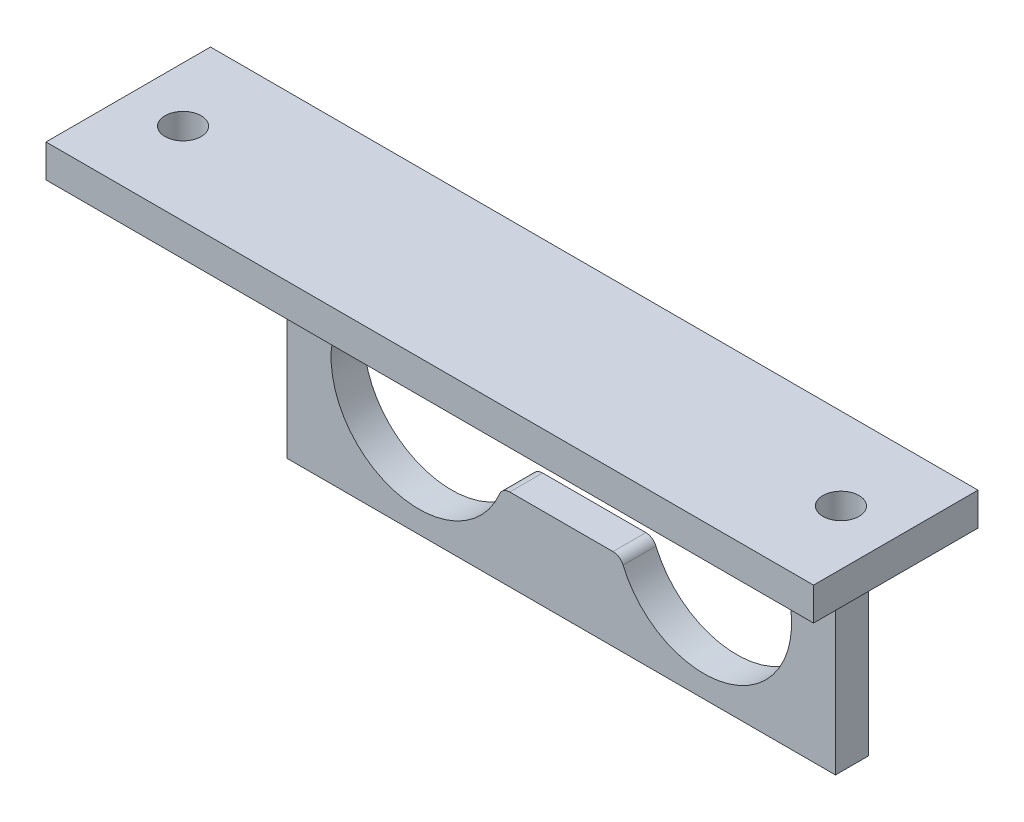
ISO-10303-21;
HEADER;
FILE_DESCRIPTION(('STEP AP214'),'2;1');
FILE_NAME('part.step','',(''),(''),'','','');
FILE_SCHEMA(('AUTOMOTIVE_DESIGN { 1 0 10303 214 1 1 1 1 }'));
ENDSEC;
DATA;
#1=APPLICATION_CONTEXT('core data for automotive mechanical design processes');
#2=APPLICATION_PROTOCOL_DEFINITION('international standard','automotive_design',2000,#1);
#3=PRODUCT_CONTEXT('',#1,'mechanical');
#4=PRODUCT('Part','Part','',(#3));
#5=PRODUCT_RELATED_PRODUCT_CATEGORY('part','',(#4));
#6=PRODUCT_DEFINITION_FORMATION('','',#4);
#7=PRODUCT_DEFINITION_CONTEXT('part definition',#1,'design');
#8=PRODUCT_DEFINITION('design','',#6,#7);
#9=PRODUCT_DEFINITION_SHAPE('','',#8);
#10=(LENGTH_UNIT() NAMED_UNIT(*) SI_UNIT(.MILLI.,.METRE.));
#11=(NAMED_UNIT(*) PLANE_ANGLE_UNIT() SI_UNIT($,.RADIAN.));
#12=(NAMED_UNIT(*) SI_UNIT($,.STERADIAN.) SOLID_ANGLE_UNIT());
#13=UNCERTAINTY_MEASURE_WITH_UNIT(LENGTH_MEASURE(1.E-05),#10,'distance_accuracy_value','');
#14=(GEOMETRIC_REPRESENTATION_CONTEXT(3) GLOBAL_UNCERTAINTY_ASSIGNED_CONTEXT((#13)) GLOBAL_UNIT_ASSIGNED_CONTEXT((#10,
#11,#12)) REPRESENTATION_CONTEXT('',''));
#15=CARTESIAN_POINT('',(0.,0.,0.));
#16=DIRECTION('',(0.,0.,1.));
#17=DIRECTION('',(1.,0.,0.));
#18=AXIS2_PLACEMENT_3D('',#15,#16,#17);
#19=CARTESIAN_POINT('',(-25.,16.,15.));
#20=DIRECTION('',(0.,0.,-1.));
#21=DIRECTION('',(-1.,0.,0.));
#22=AXIS2_PLACEMENT_3D('',#19,#20,#21);
#23=PLANE('',#22);
#24=DIRECTION('',(-1.,0.,0.));
#25=VECTOR('',#24,1.);
#26=CARTESIAN_POINT('',(25.,13.,15.));
#27=LINE('',#26,#25);
#28=CARTESIAN_POINT('',(35.,13.,15.));
#29=VERTEX_POINT('',#28);
#30=CARTESIAN_POINT('',(-35.,13.,15.));
#31=VERTEX_POINT('',#30);
#32=EDGE_CURVE('E212',#29,#31,#27,.T.);
#33=ORIENTED_EDGE('',*,*,#32,.F.);
#34=DIRECTION('',(0.,1.,0.));
#35=VECTOR('',#34,1.);
#36=CARTESIAN_POINT('',(35.,13.,15.));
#37=LINE('',#36,#35);
#38=CARTESIAN_POINT('',(35.,16.,15.));
#39=VERTEX_POINT('',#38);
#40=EDGE_CURVE('E240',#29,#39,#37,.T.);
#41=ORIENTED_EDGE('',*,*,#40,.T.);
#42=DIRECTION('',(1.,0.,0.));
#43=VECTOR('',#42,1.);
#44=CARTESIAN_POINT('',(-25.,16.,15.));
#45=LINE('',#44,#43);
#46=CARTESIAN_POINT('',(-35.,16.,15.));
#47=VERTEX_POINT('',#46);
#48=EDGE_CURVE('E256',#47,#39,#45,.T.);
#49=ORIENTED_EDGE('',*,*,#48,.F.);
#50=DIRECTION('',(0.,1.,0.));
#51=VECTOR('',#50,1.);
#52=CARTESIAN_POINT('',(-35.,13.,15.));
#53=LINE('',#52,#51);
#54=EDGE_CURVE('E207',#31,#47,#53,.T.);
#55=ORIENTED_EDGE('',*,*,#54,.F.);
#56=EDGE_LOOP('',(#33,#41,#49,#55));
#57=FACE_BOUND('',#56,.T.);
#58=ADVANCED_FACE('F39',(#57),#23,.F.);
#59=CARTESIAN_POINT('',(0.,0.,3.));
#60=DIRECTION('',(0.,0.,1.));
#61=DIRECTION('',(1.,0.,0.));
#62=AXIS2_PLACEMENT_3D('',#59,#60,#61);
#63=PLANE('',#62);
#64=DIRECTION('',(1.,0.,0.));
#65=VECTOR('',#64,1.);
#66=CARTESIAN_POINT('',(25.,13.,3.));
#67=LINE('',#66,#65);
#68=CARTESIAN_POINT('',(-26.,13.,3.));
#69=VERTEX_POINT('',#68);
#70=CARTESIAN_POINT('',(26.,13.,3.));
#71=VERTEX_POINT('',#70);
#72=EDGE_CURVE('E253',#69,#71,#67,.T.);
#73=ORIENTED_EDGE('',*,*,#72,.F.);
#74=CARTESIAN_POINT('',(-26.,12.,3.));
#75=DIRECTION('',(0.,0.,1.));
#76=DIRECTION('',(1.,0.,0.));
#77=AXIS2_PLACEMENT_3D('',#74,#75,#76);
#78=CIRCLE('',#77,1.);
#79=CARTESIAN_POINT('',(-25.,12.,3.));
#80=VERTEX_POINT('',#79);
#81=EDGE_CURVE('E11',#69,#80,#78,.F.);
#82=ORIENTED_EDGE('',*,*,#81,.T.);
#83=DIRECTION('',(0.,-1.,0.));
#84=VECTOR('',#83,1.);
#85=CARTESIAN_POINT('',(-25.,-10.,3.));
#86=LINE('',#85,#84);
#87=CARTESIAN_POINT('',(-25.,-10.,3.));
#88=VERTEX_POINT('',#87);
#89=EDGE_CURVE('E389',#80,#88,#86,.T.);
#90=ORIENTED_EDGE('',*,*,#89,.T.);
#91=DIRECTION('',(1.,0.,0.));
#92=VECTOR('',#91,1.);
#93=CARTESIAN_POINT('',(25.,-10.,3.));
#94=LINE('',#93,#92);
#95=CARTESIAN_POINT('',(25.,-10.,3.));
#96=VERTEX_POINT('',#95);
#97=EDGE_CURVE('E392',#88,#96,#94,.T.);
#98=ORIENTED_EDGE('',*,*,#97,.T.);
#99=DIRECTION('',(0.,1.,0.));
#100=VECTOR('',#99,1.);
#101=CARTESIAN_POINT('',(25.,-10.,3.));
#102=LINE('',#101,#100);
#103=CARTESIAN_POINT('',(25.,12.,3.));
#104=VERTEX_POINT('',#103);
#105=EDGE_CURVE('E396',#96,#104,#102,.T.);
#106=ORIENTED_EDGE('',*,*,#105,.T.);
#107=CARTESIAN_POINT('',(26.,12.,3.));
#108=DIRECTION('',(0.,0.,1.));
#109=DIRECTION('',(1.,0.,0.));
#110=AXIS2_PLACEMENT_3D('',#107,#108,#109);
#111=CIRCLE('',#110,1.);
#112=EDGE_CURVE('E429',#104,#71,#111,.F.);
#113=ORIENTED_EDGE('',*,*,#112,.T.);
#114=EDGE_LOOP('',(#73,#82,#90,#98,#106,#113));
#115=FACE_BOUND('',#114,.T.);
#116=CARTESIAN_POINT('',(13.,0.,3.));
#117=DIRECTION('',(0.,0.,1.));
#118=DIRECTION('',(1.,0.,0.));
#119=AXIS2_PLACEMENT_3D('',#116,#117,#118);
#120=CIRCLE('',#119,8.);
#121=CARTESIAN_POINT('',(5.62972268809911,-3.11111111111111,3.));
#122=VERTEX_POINT('',#121);
#123=CARTESIAN_POINT('',(5.62972268809911,3.11111111111111,3.));
#124=VERTEX_POINT('',#123);
#125=EDGE_CURVE('E309',#122,#124,#120,.T.);
#126=ORIENTED_EDGE('',*,*,#125,.F.);
#127=CARTESIAN_POINT('',(4.7084380241115,-3.5,3.));
#128=DIRECTION('',(0.,0.,-1.));
#129=DIRECTION('',(-1.,0.,0.));
#130=AXIS2_PLACEMENT_3D('',#127,#128,#129);
#131=CIRCLE('',#130,1.);
#132=CARTESIAN_POINT('',(4.7084380241115,-2.5,3.));
#133=VERTEX_POINT('',#132);
#134=EDGE_CURVE('E306',#133,#122,#131,.T.);
#135=ORIENTED_EDGE('',*,*,#134,.F.);
#136=DIRECTION('',(1.,0.,0.));
#137=VECTOR('',#136,1.);
#138=CARTESIAN_POINT('',(4.7084380241115,-2.5,3.));
#139=LINE('',#138,#137);
#140=CARTESIAN_POINT('',(-4.7084380241115,-2.5,3.));
#141=VERTEX_POINT('',#140);
#142=EDGE_CURVE('E329',#141,#133,#139,.T.);
#143=ORIENTED_EDGE('',*,*,#142,.F.);
#144=CARTESIAN_POINT('',(-4.7084380241115,-3.5,3.));
#145=DIRECTION('',(0.,0.,-1.));
#146=DIRECTION('',(1.,0.,0.));
#147=AXIS2_PLACEMENT_3D('',#144,#145,#146);
#148=CIRCLE('',#147,1.);
#149=CARTESIAN_POINT('',(-5.62972268809911,-3.11111111111111,3.));
#150=VERTEX_POINT('',#149);
#151=EDGE_CURVE('E325',#150,#141,#148,.T.);
#152=ORIENTED_EDGE('',*,*,#151,.F.);
#153=CARTESIAN_POINT('',(-13.,0.,3.));
#154=DIRECTION('',(0.,0.,1.));
#155=DIRECTION('',(1.,0.,0.));
#156=AXIS2_PLACEMENT_3D('',#153,#154,#155);
#157=CIRCLE('',#156,8.);
#158=CARTESIAN_POINT('',(-5.62972268809911,3.11111111111111,3.));
#159=VERTEX_POINT('',#158);
#160=EDGE_CURVE('E322',#159,#150,#157,.T.);
#161=ORIENTED_EDGE('',*,*,#160,.F.);
#162=CARTESIAN_POINT('',(-4.7084380241115,3.5,3.));
#163=DIRECTION('',(0.,0.,-1.));
#164=DIRECTION('',(-1.,0.,0.));
#165=AXIS2_PLACEMENT_3D('',#162,#163,#164);
#166=CIRCLE('',#165,1.);
#167=CARTESIAN_POINT('',(-4.7084380241115,2.5,3.));
#168=VERTEX_POINT('',#167);
#169=EDGE_CURVE('E319',#168,#159,#166,.T.);
#170=ORIENTED_EDGE('',*,*,#169,.F.);
#171=DIRECTION('',(-1.,0.,0.));
#172=VECTOR('',#171,1.);
#173=CARTESIAN_POINT('',(-4.7084380241115,2.5,3.));
#174=LINE('',#173,#172);
#175=CARTESIAN_POINT('',(4.7084380241115,2.5,3.));
#176=VERTEX_POINT('',#175);
#177=EDGE_CURVE('E316',#176,#168,#174,.T.);
#178=ORIENTED_EDGE('',*,*,#177,.F.);
#179=CARTESIAN_POINT('',(4.7084380241115,3.5,3.));
#180=DIRECTION('',(0.,0.,-1.));
#181=DIRECTION('',(1.,0.,0.));
#182=AXIS2_PLACEMENT_3D('',#179,#180,#181);
#183=CIRCLE('',#182,1.);
#184=EDGE_CURVE('E313',#124,#176,#183,.T.);
#185=ORIENTED_EDGE('',*,*,#184,.F.);
#186=EDGE_LOOP('',(#126,#135,#143,#152,#161,#170,#178,#185));
#187=FACE_BOUND('',#186,.T.);
#188=DIRECTION('',(-1.,0.,0.));
#189=VECTOR('',#188,1.);
#190=CARTESIAN_POINT('',(3.25,9.,3.));
#191=LINE('',#190,#189);
#192=CARTESIAN_POINT('',(3.25,9.,3.));
#193=VERTEX_POINT('',#192);
#194=CARTESIAN_POINT('',(-3.25,9.,3.));
#195=VERTEX_POINT('',#194);
#196=EDGE_CURVE('E266',#193,#195,#191,.T.);
#197=ORIENTED_EDGE('',*,*,#196,.F.);
#198=CARTESIAN_POINT('',(3.25,7.25,3.));
#199=DIRECTION('',(0.,0.,1.));
#200=DIRECTION('',(1.,0.,0.));
#201=AXIS2_PLACEMENT_3D('',#198,#199,#200);
#202=CIRCLE('',#201,1.75);
#203=CARTESIAN_POINT('',(3.25,5.5,3.));
#204=VERTEX_POINT('',#203);
#205=EDGE_CURVE('E263',#204,#193,#202,.T.);
#206=ORIENTED_EDGE('',*,*,#205,.F.);
#207=DIRECTION('',(1.,0.,0.));
#208=VECTOR('',#207,1.);
#209=CARTESIAN_POINT('',(3.25,5.5,3.));
#210=LINE('',#209,#208);
#211=CARTESIAN_POINT('',(-3.25,5.5,3.));
#212=VERTEX_POINT('',#211);
#213=EDGE_CURVE('E274',#212,#204,#210,.T.);
#214=ORIENTED_EDGE('',*,*,#213,.F.);
#215=CARTESIAN_POINT('',(-3.25,7.25,3.));
#216=DIRECTION('',(0.,0.,1.));
#217=DIRECTION('',(1.,0.,0.));
#218=AXIS2_PLACEMENT_3D('',#215,#216,#217);
#219=CIRCLE('',#218,1.75);
#220=EDGE_CURVE('E270',#195,#212,#219,.T.);
#221=ORIENTED_EDGE('',*,*,#220,.F.);
#222=EDGE_LOOP('',(#197,#206,#214,#221));
#223=FACE_BOUND('',#222,.T.);
#224=ADVANCED_FACE('F448',(#115,#187,#223),#63,.T.);
#225=CARTESIAN_POINT('',(0.,0.,0.));
#226=DIRECTION('',(0.,0.,1.));
#227=DIRECTION('',(1.,0.,0.));
#228=AXIS2_PLACEMENT_3D('',#225,#226,#227);
#229=PLANE('',#228);
#230=CARTESIAN_POINT('',(4.7084380241115,-3.5,0.));
#231=DIRECTION('',(0.,0.,-1.));
#232=DIRECTION('',(-1.,0.,0.));
#233=AXIS2_PLACEMENT_3D('',#230,#231,#232);
#234=CIRCLE('',#233,1.);
#235=CARTESIAN_POINT('',(4.7084380241115,-2.5,0.));
#236=VERTEX_POINT('',#235);
#237=CARTESIAN_POINT('',(5.62972268809911,-3.11111111111111,0.));
#238=VERTEX_POINT('',#237);
#239=EDGE_CURVE('E305',#236,#238,#234,.T.);
#240=ORIENTED_EDGE('',*,*,#239,.T.);
#241=CARTESIAN_POINT('',(13.,0.,0.));
#242=DIRECTION('',(0.,0.,1.));
#243=DIRECTION('',(1.,0.,0.));
#244=AXIS2_PLACEMENT_3D('',#241,#242,#243);
#245=CIRCLE('',#244,8.);
#246=CARTESIAN_POINT('',(5.62972268809911,3.11111111111111,0.));
#247=VERTEX_POINT('',#246);
#248=EDGE_CURVE('E336',#238,#247,#245,.T.);
#249=ORIENTED_EDGE('',*,*,#248,.T.);
#250=CARTESIAN_POINT('',(4.7084380241115,3.5,0.));
#251=DIRECTION('',(0.,0.,-1.));
#252=DIRECTION('',(1.,0.,0.));
#253=AXIS2_PLACEMENT_3D('',#250,#251,#252);
#254=CIRCLE('',#253,1.);
#255=CARTESIAN_POINT('',(4.7084380241115,2.5,0.));
#256=VERTEX_POINT('',#255);
#257=EDGE_CURVE('E340',#247,#256,#254,.T.);
#258=ORIENTED_EDGE('',*,*,#257,.T.);
#259=DIRECTION('',(-1.,0.,0.));
#260=VECTOR('',#259,1.);
#261=CARTESIAN_POINT('',(-4.7084380241115,2.5,0.));
#262=LINE('',#261,#260);
#263=CARTESIAN_POINT('',(-4.7084380241115,2.5,0.));
#264=VERTEX_POINT('',#263);
#265=EDGE_CURVE('E344',#256,#264,#262,.T.);
#266=ORIENTED_EDGE('',*,*,#265,.T.);
#267=CARTESIAN_POINT('',(-4.7084380241115,3.5,0.));
#268=DIRECTION('',(0.,0.,-1.));
#269=DIRECTION('',(-1.,0.,0.));
#270=AXIS2_PLACEMENT_3D('',#267,#268,#269);
#271=CIRCLE('',#270,1.);
#272=CARTESIAN_POINT('',(-5.62972268809911,3.11111111111111,0.));
#273=VERTEX_POINT('',#272);
#274=EDGE_CURVE('E348',#264,#273,#271,.T.);
#275=ORIENTED_EDGE('',*,*,#274,.T.);
#276=CARTESIAN_POINT('',(-13.,0.,0.));
#277=DIRECTION('',(0.,0.,1.));
#278=DIRECTION('',(1.,0.,0.));
#279=AXIS2_PLACEMENT_3D('',#276,#277,#278);
#280=CIRCLE('',#279,8.);
#281=CARTESIAN_POINT('',(-5.62972268809911,-3.11111111111111,0.));
#282=VERTEX_POINT('',#281);
#283=EDGE_CURVE('E352',#273,#282,#280,.T.);
#284=ORIENTED_EDGE('',*,*,#283,.T.);
#285=CARTESIAN_POINT('',(-4.7084380241115,-3.5,0.));
#286=DIRECTION('',(0.,0.,-1.));
#287=DIRECTION('',(1.,0.,0.));
#288=AXIS2_PLACEMENT_3D('',#285,#286,#287);
#289=CIRCLE('',#288,1.);
#290=CARTESIAN_POINT('',(-4.7084380241115,-2.5,0.));
#291=VERTEX_POINT('',#290);
#292=EDGE_CURVE('E356',#282,#291,#289,.T.);
#293=ORIENTED_EDGE('',*,*,#292,.T.);
#294=DIRECTION('',(1.,0.,0.));
#295=VECTOR('',#294,1.);
#296=CARTESIAN_POINT('',(4.7084380241115,-2.5,0.));
#297=LINE('',#296,#295);
#298=EDGE_CURVE('E310',#291,#236,#297,.T.);
#299=ORIENTED_EDGE('',*,*,#298,.T.);
#300=EDGE_LOOP('',(#240,#249,#258,#266,#275,#284,#293,#299));
#301=FACE_BOUND('',#300,.T.);
#302=DIRECTION('',(0.,-1.,0.));
#303=VECTOR('',#302,1.);
#304=CARTESIAN_POINT('',(-25.,-10.,0.));
#305=LINE('',#304,#303);
#306=CARTESIAN_POINT('',(-25.,12.,0.));
#307=VERTEX_POINT('',#306);
#308=CARTESIAN_POINT('',(-25.,-10.,0.));
#309=VERTEX_POINT('',#308);
#310=EDGE_CURVE('E388',#307,#309,#305,.T.);
#311=ORIENTED_EDGE('',*,*,#310,.F.);
#312=CARTESIAN_POINT('',(-26.,12.,0.));
#313=DIRECTION('',(0.,0.,1.));
#314=DIRECTION('',(1.,0.,0.));
#315=AXIS2_PLACEMENT_3D('',#312,#313,#314);
#316=CIRCLE('',#315,1.);
#317=CARTESIAN_POINT('',(-26.,13.,0.));
#318=VERTEX_POINT('',#317);
#319=EDGE_CURVE('E48',#307,#318,#316,.T.);
#320=ORIENTED_EDGE('',*,*,#319,.T.);
#321=DIRECTION('',(-1.,0.,0.));
#322=VECTOR('',#321,1.);
#323=CARTESIAN_POINT('',(-25.,13.,0.));
#324=LINE('',#323,#322);
#325=CARTESIAN_POINT('',(-35.,13.,0.));
#326=VERTEX_POINT('',#325);
#327=EDGE_CURVE('E187',#318,#326,#324,.T.);
#328=ORIENTED_EDGE('',*,*,#327,.T.);
#329=DIRECTION('',(0.,1.,0.));
#330=VECTOR('',#329,1.);
#331=CARTESIAN_POINT('',(-35.,13.,0.));
#332=LINE('',#331,#330);
#333=CARTESIAN_POINT('',(-35.,16.,0.));
#334=VERTEX_POINT('',#333);
#335=EDGE_CURVE('E192',#326,#334,#332,.T.);
#336=ORIENTED_EDGE('',*,*,#335,.T.);
#337=DIRECTION('',(-1.,0.,0.));
#338=VECTOR('',#337,1.);
#339=CARTESIAN_POINT('',(-25.,16.,0.));
#340=LINE('',#339,#338);
#341=CARTESIAN_POINT('',(35.,16.,0.));
#342=VERTEX_POINT('',#341);
#343=EDGE_CURVE('E259',#342,#334,#340,.T.);
#344=ORIENTED_EDGE('',*,*,#343,.F.);
#345=DIRECTION('',(0.,1.,0.));
#346=VECTOR('',#345,1.);
#347=CARTESIAN_POINT('',(35.,13.,0.));
#348=LINE('',#347,#346);
#349=CARTESIAN_POINT('',(35.,13.,0.));
#350=VERTEX_POINT('',#349);
#351=EDGE_CURVE('E244',#350,#342,#348,.T.);
#352=ORIENTED_EDGE('',*,*,#351,.F.);
#353=DIRECTION('',(-1.,0.,0.));
#354=VECTOR('',#353,1.);
#355=CARTESIAN_POINT('',(25.,13.,0.));
#356=LINE('',#355,#354);
#357=CARTESIAN_POINT('',(26.,13.,0.));
#358=VERTEX_POINT('',#357);
#359=EDGE_CURVE('E236',#350,#358,#356,.T.);
#360=ORIENTED_EDGE('',*,*,#359,.T.);
#361=CARTESIAN_POINT('',(26.,12.,0.));
#362=DIRECTION('',(0.,0.,1.));
#363=DIRECTION('',(1.,0.,0.));
#364=AXIS2_PLACEMENT_3D('',#361,#362,#363);
#365=CIRCLE('',#364,1.);
#366=CARTESIAN_POINT('',(25.,12.,0.));
#367=VERTEX_POINT('',#366);
#368=EDGE_CURVE('E433',#358,#367,#365,.T.);
#369=ORIENTED_EDGE('',*,*,#368,.T.);
#370=DIRECTION('',(0.,1.,0.));
#371=VECTOR('',#370,1.);
#372=CARTESIAN_POINT('',(25.,-10.,0.));
#373=LINE('',#372,#371);
#374=CARTESIAN_POINT('',(25.,-10.,0.));
#375=VERTEX_POINT('',#374);
#376=EDGE_CURVE('E393',#375,#367,#373,.T.);
#377=ORIENTED_EDGE('',*,*,#376,.F.);
#378=DIRECTION('',(1.,0.,0.));
#379=VECTOR('',#378,1.);
#380=CARTESIAN_POINT('',(25.,-10.,0.));
#381=LINE('',#380,#379);
#382=EDGE_CURVE('E403',#309,#375,#381,.T.);
#383=ORIENTED_EDGE('',*,*,#382,.F.);
#384=EDGE_LOOP('',(#311,#320,#328,#336,#344,#352,#360,#369,#377,#383));
#385=FACE_BOUND('',#384,.T.);
#386=CARTESIAN_POINT('',(3.25,7.25,0.));
#387=DIRECTION('',(0.,0.,1.));
#388=DIRECTION('',(1.,0.,0.));
#389=AXIS2_PLACEMENT_3D('',#386,#387,#388);
#390=CIRCLE('',#389,1.75);
#391=CARTESIAN_POINT('',(3.25,5.5,0.));
#392=VERTEX_POINT('',#391);
#393=CARTESIAN_POINT('',(3.25,9.,0.));
#394=VERTEX_POINT('',#393);
#395=EDGE_CURVE('E262',#392,#394,#390,.T.);
#396=ORIENTED_EDGE('',*,*,#395,.T.);
#397=DIRECTION('',(-1.,0.,0.));
#398=VECTOR('',#397,1.);
#399=CARTESIAN_POINT('',(3.25,9.,0.));
#400=LINE('',#399,#398);
#401=CARTESIAN_POINT('',(-3.25,9.,0.));
#402=VERTEX_POINT('',#401);
#403=EDGE_CURVE('E281',#394,#402,#400,.T.);
#404=ORIENTED_EDGE('',*,*,#403,.T.);
#405=CARTESIAN_POINT('',(-3.25,7.25,0.));
#406=DIRECTION('',(0.,0.,1.));
#407=DIRECTION('',(1.,0.,0.));
#408=AXIS2_PLACEMENT_3D('',#405,#406,#407);
#409=CIRCLE('',#408,1.75);
#410=CARTESIAN_POINT('',(-3.25,5.5,0.));
#411=VERTEX_POINT('',#410);
#412=EDGE_CURVE('E285',#402,#411,#409,.T.);
#413=ORIENTED_EDGE('',*,*,#412,.T.);
#414=DIRECTION('',(1.,0.,0.));
#415=VECTOR('',#414,1.);
#416=CARTESIAN_POINT('',(3.25,5.5,0.));
#417=LINE('',#416,#415);
#418=EDGE_CURVE('E267',#411,#392,#417,.T.);
#419=ORIENTED_EDGE('',*,*,#418,.T.);
#420=EDGE_LOOP('',(#396,#404,#413,#419));
#421=FACE_BOUND('',#420,.T.);
#422=ADVANCED_FACE('F190',(#301,#385,#421),#229,.F.);
#423=CARTESIAN_POINT('',(-25.,-10.,3.));
#424=DIRECTION('',(1.,0.,0.));
#425=DIRECTION('',(0.,0.,-1.));
#426=AXIS2_PLACEMENT_3D('',#423,#424,#425);
#427=PLANE('',#426);
#428=ORIENTED_EDGE('',*,*,#89,.F.);
#429=DIRECTION('',(0.,0.,-1.));
#430=VECTOR('',#429,1.);
#431=CARTESIAN_POINT('',(-25.,12.,3.));
#432=LINE('',#431,#430);
#433=EDGE_CURVE('E426',#80,#307,#432,.T.);
#434=ORIENTED_EDGE('',*,*,#433,.T.);
#435=ORIENTED_EDGE('',*,*,#310,.T.);
#436=DIRECTION('',(0.,0.,-1.));
#437=VECTOR('',#436,1.);
#438=CARTESIAN_POINT('',(-25.,-10.,3.));
#439=LINE('',#438,#437);
#440=EDGE_CURVE('E412',#88,#309,#439,.T.);
#441=ORIENTED_EDGE('',*,*,#440,.F.);
#442=EDGE_LOOP('',(#428,#434,#435,#441));
#443=FACE_BOUND('',#442,.T.);
#444=ADVANCED_FACE('F455',(#443),#427,.F.);
#445=CARTESIAN_POINT('',(25.,-10.,3.));
#446=DIRECTION('',(0.,1.,0.));
#447=DIRECTION('',(-1.,0.,0.));
#448=AXIS2_PLACEMENT_3D('',#445,#446,#447);
#449=PLANE('',#448);
#450=ORIENTED_EDGE('',*,*,#382,.T.);
#451=DIRECTION('',(0.,0.,-1.));
#452=VECTOR('',#451,1.);
#453=CARTESIAN_POINT('',(25.,-10.,3.));
#454=LINE('',#453,#452);
#455=EDGE_CURVE('E400',#96,#375,#454,.T.);
#456=ORIENTED_EDGE('',*,*,#455,.F.);
#457=ORIENTED_EDGE('',*,*,#97,.F.);
#458=ORIENTED_EDGE('',*,*,#440,.T.);
#459=EDGE_LOOP('',(#450,#456,#457,#458));
#460=FACE_BOUND('',#459,.T.);
#461=ADVANCED_FACE('F453',(#460),#449,.F.);
#462=CARTESIAN_POINT('',(25.,-10.,3.));
#463=DIRECTION('',(-1.,0.,0.));
#464=DIRECTION('',(0.,0.,1.));
#465=AXIS2_PLACEMENT_3D('',#462,#463,#464);
#466=PLANE('',#465);
#467=ORIENTED_EDGE('',*,*,#376,.T.);
#468=DIRECTION('',(0.,0.,1.));
#469=VECTOR('',#468,1.);
#470=CARTESIAN_POINT('',(25.,12.,3.));
#471=LINE('',#470,#469);
#472=EDGE_CURVE('E416',#367,#104,#471,.T.);
#473=ORIENTED_EDGE('',*,*,#472,.T.);
#474=ORIENTED_EDGE('',*,*,#105,.F.);
#475=ORIENTED_EDGE('',*,*,#455,.T.);
#476=EDGE_LOOP('',(#467,#473,#474,#475));
#477=FACE_BOUND('',#476,.T.);
#478=ADVANCED_FACE('F444',(#477),#466,.F.);
#479=CARTESIAN_POINT('',(4.7084380241115,-3.5,3.));
#480=DIRECTION('',(0.,0.,-1.));
#481=DIRECTION('',(-1.,0.,0.));
#482=AXIS2_PLACEMENT_3D('',#479,#480,#481);
#483=CYLINDRICAL_SURFACE('',#482,1.);
#484=ORIENTED_EDGE('',*,*,#239,.F.);
#485=DIRECTION('',(0.,0.,-1.));
#486=VECTOR('',#485,1.);
#487=CARTESIAN_POINT('',(4.7084380241115,-2.5,3.));
#488=LINE('',#487,#486);
#489=EDGE_CURVE('E332',#133,#236,#488,.T.);
#490=ORIENTED_EDGE('',*,*,#489,.F.);
#491=ORIENTED_EDGE('',*,*,#134,.T.);
#492=DIRECTION('',(0.,0.,-1.));
#493=VECTOR('',#492,1.);
#494=CARTESIAN_POINT('',(5.62972268809911,-3.11111111111111,3.));
#495=LINE('',#494,#493);
#496=EDGE_CURVE('E384',#122,#238,#495,.T.);
#497=ORIENTED_EDGE('',*,*,#496,.T.);
#498=EDGE_LOOP('',(#484,#490,#491,#497));
#499=FACE_BOUND('',#498,.T.);
#500=ADVANCED_FACE('F539',(#499),#483,.T.);
#501=CARTESIAN_POINT('',(13.,0.,3.));
#502=DIRECTION('',(0.,0.,-1.));
#503=DIRECTION('',(-1.,0.,0.));
#504=AXIS2_PLACEMENT_3D('',#501,#502,#503);
#505=CYLINDRICAL_SURFACE('',#504,8.);
#506=ORIENTED_EDGE('',*,*,#248,.F.);
#507=ORIENTED_EDGE('',*,*,#496,.F.);
#508=ORIENTED_EDGE('',*,*,#125,.T.);
#509=DIRECTION('',(0.,0.,-1.));
#510=VECTOR('',#509,1.);
#511=CARTESIAN_POINT('',(5.62972268809911,3.11111111111111,3.));
#512=LINE('',#511,#510);
#513=EDGE_CURVE('E381',#124,#247,#512,.T.);
#514=ORIENTED_EDGE('',*,*,#513,.T.);
#515=EDGE_LOOP('',(#506,#507,#508,#514));
#516=FACE_BOUND('',#515,.T.);
#517=ADVANCED_FACE('F535',(#516),#505,.F.);
#518=CARTESIAN_POINT('',(4.7084380241115,3.5,3.));
#519=DIRECTION('',(0.,0.,-1.));
#520=DIRECTION('',(-1.,0.,0.));
#521=AXIS2_PLACEMENT_3D('',#518,#519,#520);
#522=CYLINDRICAL_SURFACE('',#521,1.);
#523=ORIENTED_EDGE('',*,*,#257,.F.);
#524=ORIENTED_EDGE('',*,*,#513,.F.);
#525=ORIENTED_EDGE('',*,*,#184,.T.);
#526=DIRECTION('',(0.,0.,-1.));
#527=VECTOR('',#526,1.);
#528=CARTESIAN_POINT('',(4.7084380241115,2.5,3.));
#529=LINE('',#528,#527);
#530=EDGE_CURVE('E378',#176,#256,#529,.T.);
#531=ORIENTED_EDGE('',*,*,#530,.T.);
#532=EDGE_LOOP('',(#523,#524,#525,#531));
#533=FACE_BOUND('',#532,.T.);
#534=ADVANCED_FACE('F531',(#533),#522,.T.);
#535=CARTESIAN_POINT('',(-4.7084380241115,2.5,3.));
#536=DIRECTION('',(0.,-1.,0.));
#537=DIRECTION('',(0.,0.,-1.));
#538=AXIS2_PLACEMENT_3D('',#535,#536,#537);
#539=PLANE('',#538);
#540=ORIENTED_EDGE('',*,*,#265,.F.);
#541=ORIENTED_EDGE('',*,*,#530,.F.);
#542=ORIENTED_EDGE('',*,*,#177,.T.);
#543=DIRECTION('',(0.,0.,-1.));
#544=VECTOR('',#543,1.);
#545=CARTESIAN_POINT('',(-4.7084380241115,2.5,3.));
#546=LINE('',#545,#544);
#547=EDGE_CURVE('E375',#168,#264,#546,.T.);
#548=ORIENTED_EDGE('',*,*,#547,.T.);
#549=EDGE_LOOP('',(#540,#541,#542,#548));
#550=FACE_BOUND('',#549,.T.);
#551=ADVANCED_FACE('F527',(#550),#539,.T.);
#552=CARTESIAN_POINT('',(-4.7084380241115,3.5,3.));
#553=DIRECTION('',(0.,0.,-1.));
#554=DIRECTION('',(-1.,0.,0.));
#555=AXIS2_PLACEMENT_3D('',#552,#553,#554);
#556=CYLINDRICAL_SURFACE('',#555,1.);
#557=ORIENTED_EDGE('',*,*,#274,.F.);
#558=ORIENTED_EDGE('',*,*,#547,.F.);
#559=ORIENTED_EDGE('',*,*,#169,.T.);
#560=DIRECTION('',(0.,0.,-1.));
#561=VECTOR('',#560,1.);
#562=CARTESIAN_POINT('',(-5.62972268809911,3.11111111111111,3.));
#563=LINE('',#562,#561);
#564=EDGE_CURVE('E372',#159,#273,#563,.T.);
#565=ORIENTED_EDGE('',*,*,#564,.T.);
#566=EDGE_LOOP('',(#557,#558,#559,#565));
#567=FACE_BOUND('',#566,.T.);
#568=ADVANCED_FACE('F523',(#567),#556,.T.);
#569=CARTESIAN_POINT('',(-13.,0.,3.));
#570=DIRECTION('',(0.,0.,-1.));
#571=DIRECTION('',(-1.,0.,0.));
#572=AXIS2_PLACEMENT_3D('',#569,#570,#571);
#573=CYLINDRICAL_SURFACE('',#572,8.);
#574=ORIENTED_EDGE('',*,*,#283,.F.);
#575=ORIENTED_EDGE('',*,*,#564,.F.);
#576=ORIENTED_EDGE('',*,*,#160,.T.);
#577=DIRECTION('',(0.,0.,-1.));
#578=VECTOR('',#577,1.);
#579=CARTESIAN_POINT('',(-5.62972268809911,-3.11111111111111,3.));
#580=LINE('',#579,#578);
#581=EDGE_CURVE('E369',#150,#282,#580,.T.);
#582=ORIENTED_EDGE('',*,*,#581,.T.);
#583=EDGE_LOOP('',(#574,#575,#576,#582));
#584=FACE_BOUND('',#583,.T.);
#585=ADVANCED_FACE('F519',(#584),#573,.F.);
#586=CARTESIAN_POINT('',(-4.7084380241115,-3.5,3.));
#587=DIRECTION('',(0.,0.,-1.));
#588=DIRECTION('',(-1.,0.,0.));
#589=AXIS2_PLACEMENT_3D('',#586,#587,#588);
#590=CYLINDRICAL_SURFACE('',#589,1.);
#591=ORIENTED_EDGE('',*,*,#292,.F.);
#592=ORIENTED_EDGE('',*,*,#581,.F.);
#593=ORIENTED_EDGE('',*,*,#151,.T.);
#594=DIRECTION('',(0.,0.,-1.));
#595=VECTOR('',#594,1.);
#596=CARTESIAN_POINT('',(-4.7084380241115,-2.5,3.));
#597=LINE('',#596,#595);
#598=EDGE_CURVE('E366',#141,#291,#597,.T.);
#599=ORIENTED_EDGE('',*,*,#598,.T.);
#600=EDGE_LOOP('',(#591,#592,#593,#599));
#601=FACE_BOUND('',#600,.T.);
#602=ADVANCED_FACE('F515',(#601),#590,.T.);
#603=CARTESIAN_POINT('',(4.7084380241115,-2.5,3.));
#604=DIRECTION('',(0.,1.,0.));
#605=DIRECTION('',(-1.,0.,0.));
#606=AXIS2_PLACEMENT_3D('',#603,#604,#605);
#607=PLANE('',#606);
#608=ORIENTED_EDGE('',*,*,#298,.F.);
#609=ORIENTED_EDGE('',*,*,#598,.F.);
#610=ORIENTED_EDGE('',*,*,#142,.T.);
#611=ORIENTED_EDGE('',*,*,#489,.T.);
#612=EDGE_LOOP('',(#608,#609,#610,#611));
#613=FACE_BOUND('',#612,.T.);
#614=ADVANCED_FACE('F511',(#613),#607,.T.);
#615=CARTESIAN_POINT('',(3.25,7.25,3.));
#616=DIRECTION('',(0.,0.,-1.));
#617=DIRECTION('',(-1.,0.,0.));
#618=AXIS2_PLACEMENT_3D('',#615,#616,#617);
#619=CYLINDRICAL_SURFACE('',#618,1.75);
#620=ORIENTED_EDGE('',*,*,#395,.F.);
#621=DIRECTION('',(0.,0.,-1.));
#622=VECTOR('',#621,1.);
#623=CARTESIAN_POINT('',(3.25,5.5,3.));
#624=LINE('',#623,#622);
#625=EDGE_CURVE('E277',#204,#392,#624,.T.);
#626=ORIENTED_EDGE('',*,*,#625,.F.);
#627=ORIENTED_EDGE('',*,*,#205,.T.);
#628=DIRECTION('',(0.,0.,-1.));
#629=VECTOR('',#628,1.);
#630=CARTESIAN_POINT('',(3.25,9.,3.));
#631=LINE('',#630,#629);
#632=EDGE_CURVE('E301',#193,#394,#631,.T.);
#633=ORIENTED_EDGE('',*,*,#632,.T.);
#634=EDGE_LOOP('',(#620,#626,#627,#633));
#635=FACE_BOUND('',#634,.T.);
#636=ADVANCED_FACE('F507',(#635),#619,.F.);
#637=CARTESIAN_POINT('',(3.25,9.,3.));
#638=DIRECTION('',(0.,-1.,0.));
#639=DIRECTION('',(1.,0.,0.));
#640=AXIS2_PLACEMENT_3D('',#637,#638,#639);
#641=PLANE('',#640);
#642=ORIENTED_EDGE('',*,*,#403,.F.);
#643=ORIENTED_EDGE('',*,*,#632,.F.);
#644=ORIENTED_EDGE('',*,*,#196,.T.);
#645=DIRECTION('',(0.,0.,-1.));
#646=VECTOR('',#645,1.);
#647=CARTESIAN_POINT('',(-3.25,9.,3.));
#648=LINE('',#647,#646);
#649=EDGE_CURVE('E298',#195,#402,#648,.T.);
#650=ORIENTED_EDGE('',*,*,#649,.T.);
#651=EDGE_LOOP('',(#642,#643,#644,#650));
#652=FACE_BOUND('',#651,.T.);
#653=ADVANCED_FACE('F503',(#652),#641,.T.);
#654=CARTESIAN_POINT('',(-3.25,7.25,3.));
#655=DIRECTION('',(0.,0.,-1.));
#656=DIRECTION('',(-1.,0.,0.));
#657=AXIS2_PLACEMENT_3D('',#654,#655,#656);
#658=CYLINDRICAL_SURFACE('',#657,1.75);
#659=ORIENTED_EDGE('',*,*,#412,.F.);
#660=ORIENTED_EDGE('',*,*,#649,.F.);
#661=ORIENTED_EDGE('',*,*,#220,.T.);
#662=DIRECTION('',(0.,0.,-1.));
#663=VECTOR('',#662,1.);
#664=CARTESIAN_POINT('',(-3.25,5.5,3.));
#665=LINE('',#664,#663);
#666=EDGE_CURVE('E295',#212,#411,#665,.T.);
#667=ORIENTED_EDGE('',*,*,#666,.T.);
#668=EDGE_LOOP('',(#659,#660,#661,#667));
#669=FACE_BOUND('',#668,.T.);
#670=ADVANCED_FACE('F499',(#669),#658,.F.);
#671=CARTESIAN_POINT('',(3.25,5.5,3.));
#672=DIRECTION('',(0.,1.,0.));
#673=DIRECTION('',(0.,0.,1.));
#674=AXIS2_PLACEMENT_3D('',#671,#672,#673);
#675=PLANE('',#674);
#676=ORIENTED_EDGE('',*,*,#418,.F.);
#677=ORIENTED_EDGE('',*,*,#666,.F.);
#678=ORIENTED_EDGE('',*,*,#213,.T.);
#679=ORIENTED_EDGE('',*,*,#625,.T.);
#680=EDGE_LOOP('',(#676,#677,#678,#679));
#681=FACE_BOUND('',#680,.T.);
#682=ADVANCED_FACE('F465',(#681),#675,.T.);
#683=CARTESIAN_POINT('',(0.,16.,0.));
#684=DIRECTION('',(0.,1.,0.));
#685=DIRECTION('',(-1.,0.,0.));
#686=AXIS2_PLACEMENT_3D('',#683,#684,#685);
#687=PLANE('',#686);
#688=ORIENTED_EDGE('',*,*,#343,.T.);
#689=DIRECTION('',(0.,0.,1.));
#690=VECTOR('',#689,1.);
#691=CARTESIAN_POINT('',(-35.,16.,15.));
#692=LINE('',#691,#690);
#693=EDGE_CURVE('E199',#334,#47,#692,.T.);
#694=ORIENTED_EDGE('',*,*,#693,.T.);
#695=ORIENTED_EDGE('',*,*,#48,.T.);
#696=DIRECTION('',(0.,0.,-1.));
#697=VECTOR('',#696,1.);
#698=CARTESIAN_POINT('',(35.,16.,15.));
#699=LINE('',#698,#697);
#700=EDGE_CURVE('E228',#39,#342,#699,.T.);
#701=ORIENTED_EDGE('',*,*,#700,.T.);
#702=EDGE_LOOP('',(#688,#694,#695,#701));
#703=FACE_BOUND('',#702,.T.);
#704=CARTESIAN_POINT('',(30.,16.,7.5));
#705=DIRECTION('',(0.,1.,0.));
#706=DIRECTION('',(-1.,0.,0.));
#707=AXIS2_PLACEMENT_3D('',#704,#705,#706);
#708=CIRCLE('',#707,1.65000000000001);
#709=CARTESIAN_POINT('',(28.35,16.,7.5));
#710=VERTEX_POINT('',#709);
#711=EDGE_CURVE('E222',#710,#710,#708,.T.);
#712=ORIENTED_EDGE('',*,*,#711,.F.);
#713=EDGE_LOOP('',(#712));
#714=FACE_BOUND('',#713,.T.);
#715=CARTESIAN_POINT('',(-30.,16.,7.5));
#716=DIRECTION('',(0.,1.,0.));
#717=DIRECTION('',(-1.,0.,0.));
#718=AXIS2_PLACEMENT_3D('',#715,#716,#717);
#719=CIRCLE('',#718,1.65);
#720=CARTESIAN_POINT('',(-31.65,16.,7.5));
#721=VERTEX_POINT('',#720);
#722=EDGE_CURVE('E471',#721,#721,#719,.T.);
#723=ORIENTED_EDGE('',*,*,#722,.F.);
#724=EDGE_LOOP('',(#723));
#725=FACE_BOUND('',#724,.T.);
#726=ADVANCED_FACE('F462',(#703,#714,#725),#687,.T.);
#727=CARTESIAN_POINT('',(0.,13.,0.));
#728=DIRECTION('',(0.,-1.,0.));
#729=DIRECTION('',(1.,0.,0.));
#730=AXIS2_PLACEMENT_3D('',#727,#728,#729);
#731=PLANE('',#730);
#732=ORIENTED_EDGE('',*,*,#72,.T.);
#733=DIRECTION('',(0.,0.,1.));
#734=VECTOR('',#733,1.);
#735=CARTESIAN_POINT('',(26.,13.,0.));
#736=LINE('',#735,#734);
#737=EDGE_CURVE('E423',#71,#358,#736,.F.);
#738=ORIENTED_EDGE('',*,*,#737,.T.);
#739=ORIENTED_EDGE('',*,*,#359,.F.);
#740=DIRECTION('',(0.,0.,-1.));
#741=VECTOR('',#740,1.);
#742=CARTESIAN_POINT('',(35.,13.,15.));
#743=LINE('',#742,#741);
#744=EDGE_CURVE('E232',#29,#350,#743,.T.);
#745=ORIENTED_EDGE('',*,*,#744,.F.);
#746=ORIENTED_EDGE('',*,*,#32,.T.);
#747=DIRECTION('',(0.,0.,1.));
#748=VECTOR('',#747,1.);
#749=CARTESIAN_POINT('',(-35.,13.,15.));
#750=LINE('',#749,#748);
#751=EDGE_CURVE('E198',#326,#31,#750,.T.);
#752=ORIENTED_EDGE('',*,*,#751,.F.);
#753=ORIENTED_EDGE('',*,*,#327,.F.);
#754=DIRECTION('',(0.,0.,-1.));
#755=VECTOR('',#754,1.);
#756=CARTESIAN_POINT('',(-26.,13.,0.));
#757=LINE('',#756,#755);
#758=EDGE_CURVE('E420',#318,#69,#757,.F.);
#759=ORIENTED_EDGE('',*,*,#758,.T.);
#760=EDGE_LOOP('',(#732,#738,#739,#745,#746,#752,#753,#759));
#761=FACE_BOUND('',#760,.T.);
#762=CARTESIAN_POINT('',(30.,13.,7.5));
#763=DIRECTION('',(0.,1.,0.));
#764=DIRECTION('',(-1.,0.,0.));
#765=AXIS2_PLACEMENT_3D('',#762,#763,#764);
#766=CIRCLE('',#765,1.65000000000001);
#767=CARTESIAN_POINT('',(28.35,13.,7.5));
#768=VERTEX_POINT('',#767);
#769=EDGE_CURVE('E224',#768,#768,#766,.T.);
#770=ORIENTED_EDGE('',*,*,#769,.T.);
#771=EDGE_LOOP('',(#770));
#772=FACE_BOUND('',#771,.T.);
#773=CARTESIAN_POINT('',(-30.,13.,7.5));
#774=DIRECTION('',(0.,1.,0.));
#775=DIRECTION('',(-1.,0.,0.));
#776=AXIS2_PLACEMENT_3D('',#773,#774,#775);
#777=CIRCLE('',#776,1.65);
#778=CARTESIAN_POINT('',(-31.65,13.,7.5));
#779=VERTEX_POINT('',#778);
#780=EDGE_CURVE('E220',#779,#779,#777,.T.);
#781=ORIENTED_EDGE('',*,*,#780,.T.);
#782=EDGE_LOOP('',(#781));
#783=FACE_BOUND('',#782,.T.);
#784=ADVANCED_FACE('F209',(#761,#772,#783),#731,.T.);
#785=CARTESIAN_POINT('',(35.,13.,15.));
#786=DIRECTION('',(1.,0.,0.));
#787=DIRECTION('',(0.,1.,0.));
#788=AXIS2_PLACEMENT_3D('',#785,#786,#787);
#789=PLANE('',#788);
#790=ORIENTED_EDGE('',*,*,#700,.F.);
#791=ORIENTED_EDGE('',*,*,#40,.F.);
#792=ORIENTED_EDGE('',*,*,#744,.T.);
#793=ORIENTED_EDGE('',*,*,#351,.T.);
#794=EDGE_LOOP('',(#790,#791,#792,#793));
#795=FACE_BOUND('',#794,.T.);
#796=ADVANCED_FACE('F459',(#795),#789,.T.);
#797=CARTESIAN_POINT('',(30.,13.,7.5));
#798=DIRECTION('',(0.,1.,0.));
#799=DIRECTION('',(-1.,0.,0.));
#800=AXIS2_PLACEMENT_3D('',#797,#798,#799);
#801=CYLINDRICAL_SURFACE('',#800,1.65000000000001);
#802=ORIENTED_EDGE('',*,*,#769,.F.);
#803=EDGE_LOOP('',(#802));
#804=FACE_BOUND('',#803,.T.);
#805=ORIENTED_EDGE('',*,*,#711,.T.);
#806=EDGE_LOOP('',(#805));
#807=FACE_BOUND('',#806,.T.);
#808=ADVANCED_FACE('F487',(#804,#807),#801,.F.);
#809=CARTESIAN_POINT('',(-35.,13.,15.));
#810=DIRECTION('',(-1.,0.,0.));
#811=DIRECTION('',(0.,-1.,0.));
#812=AXIS2_PLACEMENT_3D('',#809,#810,#811);
#813=PLANE('',#812);
#814=ORIENTED_EDGE('',*,*,#693,.F.);
#815=ORIENTED_EDGE('',*,*,#335,.F.);
#816=ORIENTED_EDGE('',*,*,#751,.T.);
#817=ORIENTED_EDGE('',*,*,#54,.T.);
#818=EDGE_LOOP('',(#814,#815,#816,#817));
#819=FACE_BOUND('',#818,.T.);
#820=ADVANCED_FACE('F203',(#819),#813,.T.);
#821=CARTESIAN_POINT('',(-30.,13.,7.5));
#822=DIRECTION('',(0.,1.,0.));
#823=DIRECTION('',(-1.,0.,0.));
#824=AXIS2_PLACEMENT_3D('',#821,#822,#823);
#825=CYLINDRICAL_SURFACE('',#824,1.65);
#826=ORIENTED_EDGE('',*,*,#780,.F.);
#827=EDGE_LOOP('',(#826));
#828=FACE_BOUND('',#827,.T.);
#829=ORIENTED_EDGE('',*,*,#722,.T.);
#830=EDGE_LOOP('',(#829));
#831=FACE_BOUND('',#830,.T.);
#832=ADVANCED_FACE('F480',(#828,#831),#825,.F.);
#833=CARTESIAN_POINT('',(26.,12.,3.));
#834=DIRECTION('',(0.,0.,1.));
#835=DIRECTION('',(1.,0.,0.));
#836=AXIS2_PLACEMENT_3D('',#833,#834,#835);
#837=CYLINDRICAL_SURFACE('',#836,1.);
#838=ORIENTED_EDGE('',*,*,#368,.F.);
#839=ORIENTED_EDGE('',*,*,#737,.F.);
#840=ORIENTED_EDGE('',*,*,#112,.F.);
#841=ORIENTED_EDGE('',*,*,#472,.F.);
#842=EDGE_LOOP('',(#838,#839,#840,#841));
#843=FACE_BOUND('',#842,.T.);
#844=ADVANCED_FACE('F447',(#843),#837,.F.);
#845=CARTESIAN_POINT('',(-26.,12.,3.));
#846=DIRECTION('',(0.,0.,-1.));
#847=DIRECTION('',(-1.,0.,0.));
#848=AXIS2_PLACEMENT_3D('',#845,#846,#847);
#849=CYLINDRICAL_SURFACE('',#848,1.);
#850=ORIENTED_EDGE('',*,*,#81,.F.);
#851=ORIENTED_EDGE('',*,*,#758,.F.);
#852=ORIENTED_EDGE('',*,*,#319,.F.);
#853=ORIENTED_EDGE('',*,*,#433,.F.);
#854=EDGE_LOOP('',(#850,#851,#852,#853));
#855=FACE_BOUND('',#854,.T.);
#856=ADVANCED_FACE('F41',(#855),#849,.F.);
#857=CLOSED_SHELL('',(#58,#224,#422,#444,#461,#478,#500,#517,#534,#551,#568,#585,#602,#614,#636,
#653,#670,#682,#726,#784,#796,#808,#820,#832,#844,#856));
#858=MANIFOLD_SOLID_BREP('B2',#857);
#859=ADVANCED_BREP_SHAPE_REPRESENTATION('',(#18,#858),#14);
#860=SHAPE_DEFINITION_REPRESENTATION(#9,#859);
ENDSEC;
END-ISO-10303-21;
